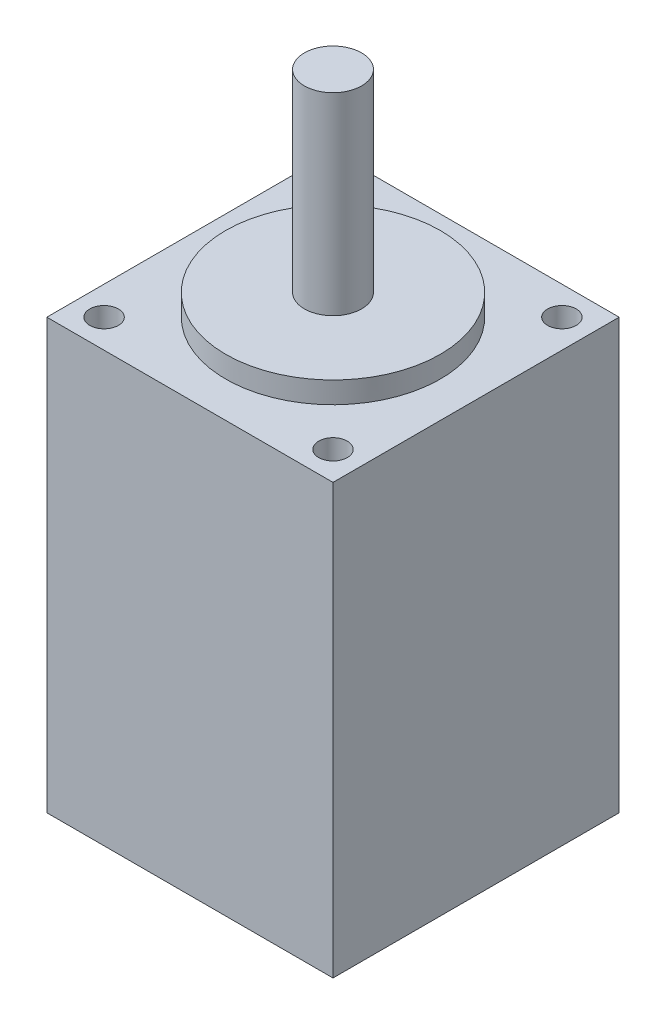
ISO-10303-21;
HEADER;
FILE_DESCRIPTION(('STEP AP214'),'2;1');
FILE_NAME('part.step','',(''),(''),'','','');
FILE_SCHEMA(('AUTOMOTIVE_DESIGN { 1 0 10303 214 1 1 1 1 }'));
ENDSEC;
DATA;
#1=APPLICATION_CONTEXT('core data for automotive mechanical design processes');
#2=APPLICATION_PROTOCOL_DEFINITION('international standard','automotive_design',2000,#1);
#3=PRODUCT_CONTEXT('',#1,'mechanical');
#4=PRODUCT('Part','Part','',(#3));
#5=PRODUCT_RELATED_PRODUCT_CATEGORY('part','',(#4));
#6=PRODUCT_DEFINITION_FORMATION('','',#4);
#7=PRODUCT_DEFINITION_CONTEXT('part definition',#1,'design');
#8=PRODUCT_DEFINITION('design','',#6,#7);
#9=PRODUCT_DEFINITION_SHAPE('','',#8);
#10=(LENGTH_UNIT() NAMED_UNIT(*) SI_UNIT(.MILLI.,.METRE.));
#11=(NAMED_UNIT(*) PLANE_ANGLE_UNIT() SI_UNIT($,.RADIAN.));
#12=(NAMED_UNIT(*) SI_UNIT($,.STERADIAN.) SOLID_ANGLE_UNIT());
#13=UNCERTAINTY_MEASURE_WITH_UNIT(LENGTH_MEASURE(1.E-05),#10,'distance_accuracy_value','');
#14=(GEOMETRIC_REPRESENTATION_CONTEXT(3) GLOBAL_UNCERTAINTY_ASSIGNED_CONTEXT((#13)) GLOBAL_UNIT_ASSIGNED_CONTEXT((#10,
#11,#12)) REPRESENTATION_CONTEXT('',''));
#15=CARTESIAN_POINT('',(0.,0.,0.));
#16=DIRECTION('',(0.,0.,1.));
#17=DIRECTION('',(1.,0.,0.));
#18=AXIS2_PLACEMENT_3D('',#15,#16,#17);
#19=CARTESIAN_POINT('',(0.,30.,0.));
#20=DIRECTION('',(1.,0.,0.));
#21=DIRECTION('',(0.,0.,-1.));
#22=AXIS2_PLACEMENT_3D('',#19,#20,#21);
#23=PLANE('',#22);
#24=DIRECTION('',(0.,0.,1.));
#25=VECTOR('',#24,1.);
#26=CARTESIAN_POINT('',(0.,0.,0.));
#27=LINE('',#26,#25);
#28=CARTESIAN_POINT('',(0.,0.,-20.));
#29=VERTEX_POINT('',#28);
#30=CARTESIAN_POINT('',(0.,0.,0.));
#31=VERTEX_POINT('',#30);
#32=EDGE_CURVE('E104',#29,#31,#27,.T.);
#33=ORIENTED_EDGE('',*,*,#32,.T.);
#34=DIRECTION('',(0.,-1.,0.));
#35=VECTOR('',#34,1.);
#36=CARTESIAN_POINT('',(0.,30.,0.));
#37=LINE('',#36,#35);
#38=CARTESIAN_POINT('',(0.,30.,0.));
#39=VERTEX_POINT('',#38);
#40=EDGE_CURVE('E95',#39,#31,#37,.T.);
#41=ORIENTED_EDGE('',*,*,#40,.F.);
#42=DIRECTION('',(0.,0.,1.));
#43=VECTOR('',#42,1.);
#44=CARTESIAN_POINT('',(0.,30.,0.));
#45=LINE('',#44,#43);
#46=CARTESIAN_POINT('',(0.,30.,-20.));
#47=VERTEX_POINT('',#46);
#48=EDGE_CURVE('E89',#47,#39,#45,.T.);
#49=ORIENTED_EDGE('',*,*,#48,.F.);
#50=DIRECTION('',(0.,-1.,0.));
#51=VECTOR('',#50,1.);
#52=CARTESIAN_POINT('',(0.,30.,-20.));
#53=LINE('',#52,#51);
#54=EDGE_CURVE('E100',#47,#29,#53,.T.);
#55=ORIENTED_EDGE('',*,*,#54,.T.);
#56=EDGE_LOOP('',(#33,#41,#49,#55));
#57=FACE_BOUND('',#56,.T.);
#58=ADVANCED_FACE('F36',(#57),#23,.F.);
#59=CARTESIAN_POINT('',(0.,30.,0.));
#60=DIRECTION('',(0.,0.,-1.));
#61=DIRECTION('',(-1.,0.,0.));
#62=AXIS2_PLACEMENT_3D('',#59,#60,#61);
#63=PLANE('',#62);
#64=DIRECTION('',(1.,0.,0.));
#65=VECTOR('',#64,1.);
#66=CARTESIAN_POINT('',(0.,0.,0.));
#67=LINE('',#66,#65);
#68=CARTESIAN_POINT('',(20.,0.,0.));
#69=VERTEX_POINT('',#68);
#70=EDGE_CURVE('E94',#31,#69,#67,.T.);
#71=ORIENTED_EDGE('',*,*,#70,.T.);
#72=DIRECTION('',(0.,-1.,0.));
#73=VECTOR('',#72,1.);
#74=CARTESIAN_POINT('',(20.,30.,0.));
#75=LINE('',#74,#73);
#76=CARTESIAN_POINT('',(20.,30.,0.));
#77=VERTEX_POINT('',#76);
#78=EDGE_CURVE('E92',#77,#69,#75,.T.);
#79=ORIENTED_EDGE('',*,*,#78,.F.);
#80=DIRECTION('',(1.,0.,0.));
#81=VECTOR('',#80,1.);
#82=CARTESIAN_POINT('',(0.,30.,0.));
#83=LINE('',#82,#81);
#84=EDGE_CURVE('E84',#39,#77,#83,.T.);
#85=ORIENTED_EDGE('',*,*,#84,.F.);
#86=ORIENTED_EDGE('',*,*,#40,.T.);
#87=EDGE_LOOP('',(#71,#79,#85,#86));
#88=FACE_BOUND('',#87,.T.);
#89=ADVANCED_FACE('F93',(#88),#63,.F.);
#90=CARTESIAN_POINT('',(20.,30.,0.));
#91=DIRECTION('',(-1.,0.,0.));
#92=DIRECTION('',(0.,0.,1.));
#93=AXIS2_PLACEMENT_3D('',#90,#91,#92);
#94=PLANE('',#93);
#95=DIRECTION('',(0.,0.,-1.));
#96=VECTOR('',#95,1.);
#97=CARTESIAN_POINT('',(20.,0.,0.));
#98=LINE('',#97,#96);
#99=CARTESIAN_POINT('',(20.,0.,-20.));
#100=VERTEX_POINT('',#99);
#101=EDGE_CURVE('E70',#69,#100,#98,.T.);
#102=ORIENTED_EDGE('',*,*,#101,.T.);
#103=DIRECTION('',(0.,-1.,0.));
#104=VECTOR('',#103,1.);
#105=CARTESIAN_POINT('',(20.,30.,-20.));
#106=LINE('',#105,#104);
#107=CARTESIAN_POINT('',(20.,30.,-20.));
#108=VERTEX_POINT('',#107);
#109=EDGE_CURVE('E96',#108,#100,#106,.T.);
#110=ORIENTED_EDGE('',*,*,#109,.F.);
#111=DIRECTION('',(0.,0.,-1.));
#112=VECTOR('',#111,1.);
#113=CARTESIAN_POINT('',(20.,30.,0.));
#114=LINE('',#113,#112);
#115=EDGE_CURVE('E87',#77,#108,#114,.T.);
#116=ORIENTED_EDGE('',*,*,#115,.F.);
#117=ORIENTED_EDGE('',*,*,#78,.T.);
#118=EDGE_LOOP('',(#102,#110,#116,#117));
#119=FACE_BOUND('',#118,.T.);
#120=ADVANCED_FACE('F98',(#119),#94,.F.);
#121=CARTESIAN_POINT('',(0.,30.,-20.));
#122=DIRECTION('',(0.,0.,1.));
#123=DIRECTION('',(1.,0.,0.));
#124=AXIS2_PLACEMENT_3D('',#121,#122,#123);
#125=PLANE('',#124);
#126=DIRECTION('',(-1.,0.,0.));
#127=VECTOR('',#126,1.);
#128=CARTESIAN_POINT('',(0.,0.,-20.));
#129=LINE('',#128,#127);
#130=EDGE_CURVE('E76',#100,#29,#129,.T.);
#131=ORIENTED_EDGE('',*,*,#130,.T.);
#132=ORIENTED_EDGE('',*,*,#54,.F.);
#133=DIRECTION('',(-1.,0.,0.));
#134=VECTOR('',#133,1.);
#135=CARTESIAN_POINT('',(0.,30.,-20.));
#136=LINE('',#135,#134);
#137=EDGE_CURVE('E53',#108,#47,#136,.T.);
#138=ORIENTED_EDGE('',*,*,#137,.F.);
#139=ORIENTED_EDGE('',*,*,#109,.T.);
#140=EDGE_LOOP('',(#131,#132,#138,#139));
#141=FACE_BOUND('',#140,.T.);
#142=ADVANCED_FACE('F120',(#141),#125,.F.);
#143=CARTESIAN_POINT('',(0.,30.,0.));
#144=DIRECTION('',(0.,-1.,0.));
#145=DIRECTION('',(0.,0.,-1.));
#146=AXIS2_PLACEMENT_3D('',#143,#144,#145);
#147=PLANE('',#146);
#148=CARTESIAN_POINT('',(10.,30.,-10.));
#149=DIRECTION('',(0.,-1.,0.));
#150=DIRECTION('',(0.,0.,-1.));
#151=AXIS2_PLACEMENT_3D('',#148,#149,#150);
#152=CIRCLE('',#151,7.5);
#153=CARTESIAN_POINT('',(10.,30.,-17.5));
#154=VERTEX_POINT('',#153);
#155=EDGE_CURVE('E39',#154,#154,#152,.F.);
#156=ORIENTED_EDGE('',*,*,#155,.F.);
#157=EDGE_LOOP('',(#156));
#158=FACE_BOUND('',#157,.T.);
#159=CARTESIAN_POINT('',(2.,30.,-2.));
#160=DIRECTION('',(0.,1.,0.));
#161=DIRECTION('',(0.,0.,1.));
#162=AXIS2_PLACEMENT_3D('',#159,#160,#161);
#163=CIRCLE('',#162,1.);
#164=CARTESIAN_POINT('',(2.,30.,-1.));
#165=VERTEX_POINT('',#164);
#166=EDGE_CURVE('E125',#165,#165,#163,.T.);
#167=ORIENTED_EDGE('',*,*,#166,.F.);
#168=EDGE_LOOP('',(#167));
#169=FACE_BOUND('',#168,.T.);
#170=CARTESIAN_POINT('',(18.,30.,-2.));
#171=DIRECTION('',(0.,1.,0.));
#172=DIRECTION('',(0.,0.,1.));
#173=AXIS2_PLACEMENT_3D('',#170,#171,#172);
#174=CIRCLE('',#173,1.);
#175=CARTESIAN_POINT('',(18.,30.,-0.999999999999999));
#176=VERTEX_POINT('',#175);
#177=EDGE_CURVE('E129',#176,#176,#174,.T.);
#178=ORIENTED_EDGE('',*,*,#177,.F.);
#179=EDGE_LOOP('',(#178));
#180=FACE_BOUND('',#179,.T.);
#181=CARTESIAN_POINT('',(18.,30.,-18.));
#182=DIRECTION('',(0.,1.,0.));
#183=DIRECTION('',(0.,0.,1.));
#184=AXIS2_PLACEMENT_3D('',#181,#182,#183);
#185=CIRCLE('',#184,1.);
#186=CARTESIAN_POINT('',(18.,30.,-17.));
#187=VERTEX_POINT('',#186);
#188=EDGE_CURVE('E133',#187,#187,#185,.T.);
#189=ORIENTED_EDGE('',*,*,#188,.F.);
#190=EDGE_LOOP('',(#189));
#191=FACE_BOUND('',#190,.T.);
#192=CARTESIAN_POINT('',(1.99999999999999,30.,-18.));
#193=DIRECTION('',(0.,1.,0.));
#194=DIRECTION('',(0.,0.,1.));
#195=AXIS2_PLACEMENT_3D('',#192,#193,#194);
#196=CIRCLE('',#195,1.);
#197=CARTESIAN_POINT('',(1.99999999999999,30.,-17.));
#198=VERTEX_POINT('',#197);
#199=EDGE_CURVE('E136',#198,#198,#196,.T.);
#200=ORIENTED_EDGE('',*,*,#199,.F.);
#201=EDGE_LOOP('',(#200));
#202=FACE_BOUND('',#201,.T.);
#203=ORIENTED_EDGE('',*,*,#48,.T.);
#204=ORIENTED_EDGE('',*,*,#84,.T.);
#205=ORIENTED_EDGE('',*,*,#115,.T.);
#206=ORIENTED_EDGE('',*,*,#137,.T.);
#207=EDGE_LOOP('',(#203,#204,#205,#206));
#208=FACE_BOUND('',#207,.T.);
#209=ADVANCED_FACE('F85',(#158,#169,#180,#191,#202,#208),#147,.F.);
#210=CARTESIAN_POINT('',(0.,0.,0.));
#211=DIRECTION('',(0.,-1.,0.));
#212=DIRECTION('',(0.,0.,-1.));
#213=AXIS2_PLACEMENT_3D('',#210,#211,#212);
#214=PLANE('',#213);
#215=ORIENTED_EDGE('',*,*,#32,.F.);
#216=ORIENTED_EDGE('',*,*,#130,.F.);
#217=ORIENTED_EDGE('',*,*,#101,.F.);
#218=ORIENTED_EDGE('',*,*,#70,.F.);
#219=EDGE_LOOP('',(#215,#216,#217,#218));
#220=FACE_BOUND('',#219,.T.);
#221=ADVANCED_FACE('F119',(#220),#214,.T.);
#222=CARTESIAN_POINT('',(1.99999999999999,26.5,-18.));
#223=DIRECTION('',(0.,1.,0.));
#224=DIRECTION('',(0.,0.,1.));
#225=AXIS2_PLACEMENT_3D('',#222,#223,#224);
#226=CYLINDRICAL_SURFACE('',#225,1.);
#227=CARTESIAN_POINT('',(1.99999999999999,26.5,-18.));
#228=DIRECTION('',(0.,1.,0.));
#229=DIRECTION('',(0.,0.,1.));
#230=AXIS2_PLACEMENT_3D('',#227,#228,#229);
#231=CIRCLE('',#230,1.);
#232=CARTESIAN_POINT('',(1.99999999999999,26.5,-17.));
#233=VERTEX_POINT('',#232);
#234=EDGE_CURVE('E107',#233,#233,#231,.T.);
#235=ORIENTED_EDGE('',*,*,#234,.F.);
#236=EDGE_LOOP('',(#235));
#237=FACE_BOUND('',#236,.T.);
#238=ORIENTED_EDGE('',*,*,#199,.T.);
#239=EDGE_LOOP('',(#238));
#240=FACE_BOUND('',#239,.T.);
#241=ADVANCED_FACE('F193',(#237,#240),#226,.F.);
#242=CARTESIAN_POINT('',(1.99999999999999,26.5,-18.));
#243=DIRECTION('',(0.,1.,0.));
#244=DIRECTION('',(0.,0.,1.));
#245=AXIS2_PLACEMENT_3D('',#242,#243,#244);
#246=PLANE('',#245);
#247=ORIENTED_EDGE('',*,*,#234,.T.);
#248=EDGE_LOOP('',(#247));
#249=FACE_BOUND('',#248,.T.);
#250=ADVANCED_FACE('F198',(#249),#246,.T.);
#251=CARTESIAN_POINT('',(18.,26.5,-18.));
#252=DIRECTION('',(0.,1.,0.));
#253=DIRECTION('',(0.,0.,1.));
#254=AXIS2_PLACEMENT_3D('',#251,#252,#253);
#255=CYLINDRICAL_SURFACE('',#254,1.);
#256=CARTESIAN_POINT('',(18.,26.5,-18.));
#257=DIRECTION('',(0.,1.,0.));
#258=DIRECTION('',(0.,0.,1.));
#259=AXIS2_PLACEMENT_3D('',#256,#257,#258);
#260=CIRCLE('',#259,1.);
#261=CARTESIAN_POINT('',(18.,26.5,-17.));
#262=VERTEX_POINT('',#261);
#263=EDGE_CURVE('E138',#262,#262,#260,.T.);
#264=ORIENTED_EDGE('',*,*,#263,.F.);
#265=EDGE_LOOP('',(#264));
#266=FACE_BOUND('',#265,.T.);
#267=ORIENTED_EDGE('',*,*,#188,.T.);
#268=EDGE_LOOP('',(#267));
#269=FACE_BOUND('',#268,.T.);
#270=ADVANCED_FACE('F284',(#266,#269),#255,.F.);
#271=CARTESIAN_POINT('',(18.,26.5,-18.));
#272=DIRECTION('',(0.,1.,0.));
#273=DIRECTION('',(0.,0.,1.));
#274=AXIS2_PLACEMENT_3D('',#271,#272,#273);
#275=PLANE('',#274);
#276=ORIENTED_EDGE('',*,*,#263,.T.);
#277=EDGE_LOOP('',(#276));
#278=FACE_BOUND('',#277,.T.);
#279=ADVANCED_FACE('F275',(#278),#275,.T.);
#280=CARTESIAN_POINT('',(18.,26.5,-2.));
#281=DIRECTION('',(0.,1.,0.));
#282=DIRECTION('',(0.,0.,1.));
#283=AXIS2_PLACEMENT_3D('',#280,#281,#282);
#284=CYLINDRICAL_SURFACE('',#283,1.);
#285=CARTESIAN_POINT('',(18.,26.5,-2.));
#286=DIRECTION('',(0.,1.,0.));
#287=DIRECTION('',(0.,0.,1.));
#288=AXIS2_PLACEMENT_3D('',#285,#286,#287);
#289=CIRCLE('',#288,1.);
#290=CARTESIAN_POINT('',(18.,26.5,-0.999999999999999));
#291=VERTEX_POINT('',#290);
#292=EDGE_CURVE('E151',#291,#291,#289,.T.);
#293=ORIENTED_EDGE('',*,*,#292,.F.);
#294=EDGE_LOOP('',(#293));
#295=FACE_BOUND('',#294,.T.);
#296=ORIENTED_EDGE('',*,*,#177,.T.);
#297=EDGE_LOOP('',(#296));
#298=FACE_BOUND('',#297,.T.);
#299=ADVANCED_FACE('F266',(#295,#298),#284,.F.);
#300=CARTESIAN_POINT('',(18.,26.5,-2.));
#301=DIRECTION('',(0.,1.,0.));
#302=DIRECTION('',(0.,0.,1.));
#303=AXIS2_PLACEMENT_3D('',#300,#301,#302);
#304=PLANE('',#303);
#305=ORIENTED_EDGE('',*,*,#292,.T.);
#306=EDGE_LOOP('',(#305));
#307=FACE_BOUND('',#306,.T.);
#308=ADVANCED_FACE('F257',(#307),#304,.T.);
#309=CARTESIAN_POINT('',(2.,26.5,-2.));
#310=DIRECTION('',(0.,1.,0.));
#311=DIRECTION('',(0.,0.,1.));
#312=AXIS2_PLACEMENT_3D('',#309,#310,#311);
#313=CYLINDRICAL_SURFACE('',#312,1.);
#314=CARTESIAN_POINT('',(2.,26.5,-2.));
#315=DIRECTION('',(0.,1.,0.));
#316=DIRECTION('',(0.,0.,1.));
#317=AXIS2_PLACEMENT_3D('',#314,#315,#316);
#318=CIRCLE('',#317,1.);
#319=CARTESIAN_POINT('',(2.,26.5,-1.));
#320=VERTEX_POINT('',#319);
#321=EDGE_CURVE('E146',#320,#320,#318,.T.);
#322=ORIENTED_EDGE('',*,*,#321,.F.);
#323=EDGE_LOOP('',(#322));
#324=FACE_BOUND('',#323,.T.);
#325=ORIENTED_EDGE('',*,*,#166,.T.);
#326=EDGE_LOOP('',(#325));
#327=FACE_BOUND('',#326,.T.);
#328=ADVANCED_FACE('F181',(#324,#327),#313,.F.);
#329=CARTESIAN_POINT('',(2.,26.5,-2.));
#330=DIRECTION('',(0.,1.,0.));
#331=DIRECTION('',(0.,0.,1.));
#332=AXIS2_PLACEMENT_3D('',#329,#330,#331);
#333=PLANE('',#332);
#334=ORIENTED_EDGE('',*,*,#321,.T.);
#335=EDGE_LOOP('',(#334));
#336=FACE_BOUND('',#335,.T.);
#337=ADVANCED_FACE('F176',(#336),#333,.T.);
#338=CARTESIAN_POINT('',(10.,31.5,-10.));
#339=DIRECTION('',(0.,-1.,0.));
#340=DIRECTION('',(0.,0.,-1.));
#341=AXIS2_PLACEMENT_3D('',#338,#339,#340);
#342=CYLINDRICAL_SURFACE('',#341,7.5);
#343=CARTESIAN_POINT('',(10.,31.5,-10.));
#344=DIRECTION('',(0.,1.,0.));
#345=DIRECTION('',(0.,0.,1.));
#346=AXIS2_PLACEMENT_3D('',#343,#344,#345);
#347=CIRCLE('',#346,7.5);
#348=CARTESIAN_POINT('',(10.,31.5,-2.5));
#349=VERTEX_POINT('',#348);
#350=EDGE_CURVE('E147',#349,#349,#347,.T.);
#351=ORIENTED_EDGE('',*,*,#350,.F.);
#352=EDGE_LOOP('',(#351));
#353=FACE_BOUND('',#352,.T.);
#354=ORIENTED_EDGE('',*,*,#155,.T.);
#355=EDGE_LOOP('',(#354));
#356=FACE_BOUND('',#355,.T.);
#357=ADVANCED_FACE('F115',(#353,#356),#342,.T.);
#358=CARTESIAN_POINT('',(10.,31.5,-10.));
#359=DIRECTION('',(0.,1.,0.));
#360=DIRECTION('',(0.,0.,1.));
#361=AXIS2_PLACEMENT_3D('',#358,#359,#360);
#362=PLANE('',#361);
#363=CARTESIAN_POINT('',(10.,31.5,-10.));
#364=DIRECTION('',(0.,1.,0.));
#365=DIRECTION('',(0.,0.,1.));
#366=AXIS2_PLACEMENT_3D('',#363,#364,#365);
#367=CIRCLE('',#366,2.);
#368=CARTESIAN_POINT('',(10.,31.5,-8.));
#369=VERTEX_POINT('',#368);
#370=EDGE_CURVE('E11',#369,#369,#367,.T.);
#371=ORIENTED_EDGE('',*,*,#370,.F.);
#372=EDGE_LOOP('',(#371));
#373=FACE_BOUND('',#372,.T.);
#374=ORIENTED_EDGE('',*,*,#350,.T.);
#375=EDGE_LOOP('',(#374));
#376=FACE_BOUND('',#375,.T.);
#377=ADVANCED_FACE('F166',(#373,#376),#362,.T.);
#378=CARTESIAN_POINT('',(10.,45.,-10.));
#379=DIRECTION('',(0.,-1.,0.));
#380=DIRECTION('',(0.,0.,-1.));
#381=AXIS2_PLACEMENT_3D('',#378,#379,#380);
#382=CYLINDRICAL_SURFACE('',#381,2.);
#383=CARTESIAN_POINT('',(10.,45.,-10.));
#384=DIRECTION('',(0.,1.,0.));
#385=DIRECTION('',(0.,0.,1.));
#386=AXIS2_PLACEMENT_3D('',#383,#384,#385);
#387=CIRCLE('',#386,2.);
#388=CARTESIAN_POINT('',(10.,45.,-8.));
#389=VERTEX_POINT('',#388);
#390=EDGE_CURVE('E156',#389,#389,#387,.T.);
#391=ORIENTED_EDGE('',*,*,#390,.F.);
#392=EDGE_LOOP('',(#391));
#393=FACE_BOUND('',#392,.T.);
#394=ORIENTED_EDGE('',*,*,#370,.T.);
#395=EDGE_LOOP('',(#394));
#396=FACE_BOUND('',#395,.T.);
#397=ADVANCED_FACE('F163',(#393,#396),#382,.T.);
#398=CARTESIAN_POINT('',(10.,45.,-10.));
#399=DIRECTION('',(0.,1.,0.));
#400=DIRECTION('',(0.,0.,1.));
#401=AXIS2_PLACEMENT_3D('',#398,#399,#400);
#402=PLANE('',#401);
#403=ORIENTED_EDGE('',*,*,#390,.T.);
#404=EDGE_LOOP('',(#403));
#405=FACE_BOUND('',#404,.T.);
#406=ADVANCED_FACE('F161',(#405),#402,.T.);
#407=CLOSED_SHELL('',(#58,#89,#120,#142,#209,#221,#241,#250,#270,#279,#299,#308,#328,#337,#357,
#377,#397,#406));
#408=MANIFOLD_SOLID_BREP('B2',#407);
#409=ADVANCED_BREP_SHAPE_REPRESENTATION('',(#18,#408),#14);
#410=SHAPE_DEFINITION_REPRESENTATION(#9,#409);
ENDSEC;
END-ISO-10303-21;
